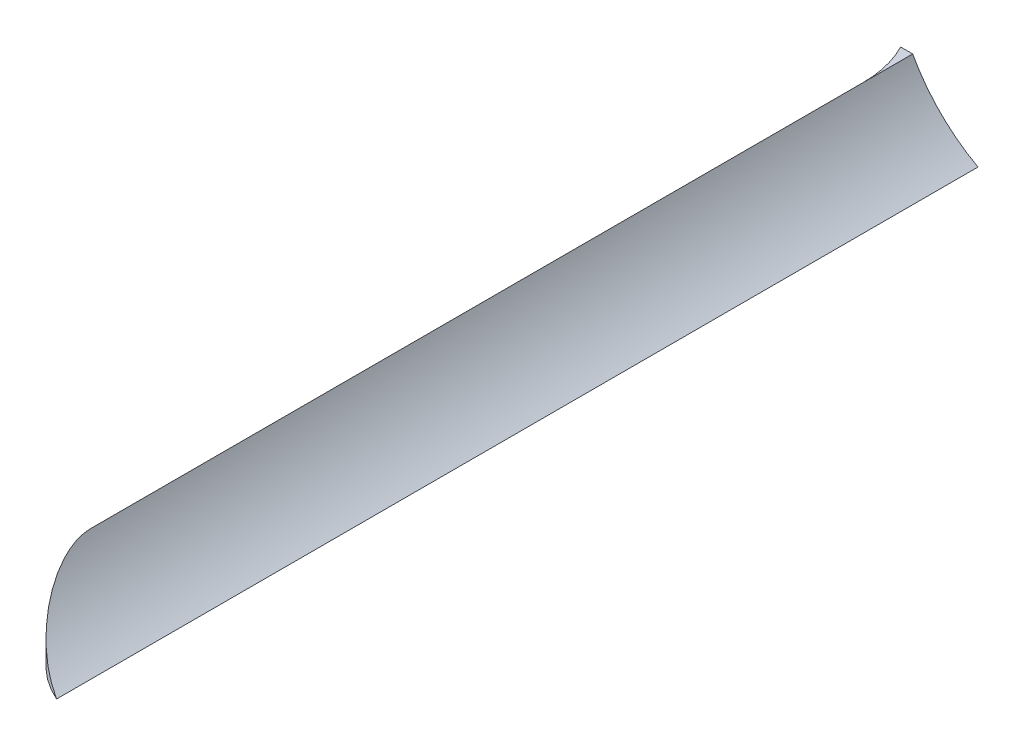
ISO-10303-21;
HEADER;
FILE_DESCRIPTION(('STEP AP214'),'2;1');
FILE_NAME('part.step','',(''),(''),'','','');
FILE_SCHEMA(('AUTOMOTIVE_DESIGN { 1 0 10303 214 1 1 1 1 }'));
ENDSEC;
DATA;
#1=APPLICATION_CONTEXT('core data for automotive mechanical design processes');
#2=APPLICATION_PROTOCOL_DEFINITION('international standard','automotive_design',2000,#1);
#3=PRODUCT_CONTEXT('',#1,'mechanical');
#4=PRODUCT('Part','Part','',(#3));
#5=PRODUCT_RELATED_PRODUCT_CATEGORY('part','',(#4));
#6=PRODUCT_DEFINITION_FORMATION('','',#4);
#7=PRODUCT_DEFINITION_CONTEXT('part definition',#1,'design');
#8=PRODUCT_DEFINITION('design','',#6,#7);
#9=PRODUCT_DEFINITION_SHAPE('','',#8);
#10=(LENGTH_UNIT() NAMED_UNIT(*) SI_UNIT(.MILLI.,.METRE.));
#11=(NAMED_UNIT(*) PLANE_ANGLE_UNIT() SI_UNIT($,.RADIAN.));
#12=(NAMED_UNIT(*) SI_UNIT($,.STERADIAN.) SOLID_ANGLE_UNIT());
#13=UNCERTAINTY_MEASURE_WITH_UNIT(LENGTH_MEASURE(1.E-05),#10,'distance_accuracy_value','');
#14=(GEOMETRIC_REPRESENTATION_CONTEXT(3) GLOBAL_UNCERTAINTY_ASSIGNED_CONTEXT((#13)) GLOBAL_UNIT_ASSIGNED_CONTEXT((#10,
#11,#12)) REPRESENTATION_CONTEXT('',''));
#15=CARTESIAN_POINT('',(0.,0.,0.));
#16=DIRECTION('',(0.,0.,1.));
#17=DIRECTION('',(1.,0.,0.));
#18=AXIS2_PLACEMENT_3D('',#15,#16,#17);
#19=CARTESIAN_POINT('',(-1.,0.,0.4572479123979));
#20=DIRECTION('',(0.,1.,0.));
#21=DIRECTION('',(0.,0.,1.));
#22=AXIS2_PLACEMENT_3D('',#19,#20,#21);
#23=CYLINDRICAL_SURFACE('',#22,1.);
#24=DIRECTION('',(0.,1.,0.));
#25=VECTOR('',#24,1.);
#26=CARTESIAN_POINT('',(-0.1106607246906,0.,0.));
#27=LINE('',#26,#25);
#28=CARTESIAN_POINT('',(-0.110660724690624,0.6,0.));
#29=VERTEX_POINT('',#28);
#30=CARTESIAN_POINT('',(-0.110660724690624,0.,0.));
#31=VERTEX_POINT('',#30);
#32=EDGE_CURVE('E59',#29,#31,#27,.F.);
#33=ORIENTED_EDGE('',*,*,#32,.T.);
#34=CARTESIAN_POINT('',(-1.,0.,0.4572479123979));
#35=DIRECTION('',(0.,1.,0.));
#36=DIRECTION('',(0.,0.,1.));
#37=AXIS2_PLACEMENT_3D('',#34,#35,#36);
#38=CIRCLE('',#37,1.);
#39=CARTESIAN_POINT('',(0.,0.,0.4572479123979));
#40=VERTEX_POINT('',#39);
#41=EDGE_CURVE('E122',#40,#31,#38,.T.);
#42=ORIENTED_EDGE('',*,*,#41,.F.);
#43=DIRECTION('',(0.,1.,0.));
#44=VECTOR('',#43,1.);
#45=CARTESIAN_POINT('',(0.,0.6,0.4572479123979));
#46=LINE('',#45,#44);
#47=CARTESIAN_POINT('',(1.2490009027033E-13,0.600000000000068,0.4572479123979));
#48=VERTEX_POINT('',#47);
#49=EDGE_CURVE('E60',#48,#40,#46,.F.);
#50=ORIENTED_EDGE('',*,*,#49,.F.);
#51=CARTESIAN_POINT('',(-1.,0.6,0.4572479123979));
#52=DIRECTION('',(0.,1.,0.));
#53=DIRECTION('',(0.,0.,1.));
#54=AXIS2_PLACEMENT_3D('',#51,#52,#53);
#55=CIRCLE('',#54,1.);
#56=EDGE_CURVE('E19',#29,#48,#55,.F.);
#57=ORIENTED_EDGE('',*,*,#56,.F.);
#58=EDGE_LOOP('',(#33,#42,#50,#57));
#59=FACE_BOUND('',#58,.T.);
#60=ADVANCED_FACE('F16',(#59),#23,.F.);
#61=CARTESIAN_POINT('',(1.,0.,7.55));
#62=DIRECTION('',(0.,1.,0.));
#63=DIRECTION('',(0.,0.,1.));
#64=AXIS2_PLACEMENT_3D('',#61,#62,#63);
#65=CYLINDRICAL_SURFACE('',#64,1.);
#66=CARTESIAN_POINT('',(1.,0.,7.55));
#67=DIRECTION('',(0.,1.,0.));
#68=DIRECTION('',(0.,0.,1.));
#69=AXIS2_PLACEMENT_3D('',#66,#67,#68);
#70=CIRCLE('',#69,1.);
#71=CARTESIAN_POINT('',(0.600000000000102,1.43396669214708E-13,8.46651513899121));
#72=VERTEX_POINT('',#71);
#73=CARTESIAN_POINT('',(0.,0.,7.55));
#74=VERTEX_POINT('',#73);
#75=EDGE_CURVE('E92',#72,#74,#70,.F.);
#76=ORIENTED_EDGE('',*,*,#75,.F.);
#77=CARTESIAN_POINT('',(0.600000000000069,2.86875633336372E-13,8.4665151389912));
#78=CARTESIAN_POINT('',(0.570312075614977,0.01616551991678,8.45355338562606));
#79=CARTESIAN_POINT('',(0.54163488125021,0.0330837160364432,8.43932597003594));
#80=CARTESIAN_POINT('',(0.486369742379199,0.068132853481344,8.40859421881288));
#81=CARTESIAN_POINT('',(0.459779245325686,0.0862622612762314,8.39209273527891));
#82=CARTESIAN_POINT('',(0.383170267730164,0.142065383923049,8.33953042426375));
#83=CARTESIAN_POINT('',(0.336270221781402,0.181178753494327,8.30039182956685));
#84=CARTESIAN_POINT('',(0.251126178114052,0.260679143637095,8.21542986113054));
#85=CARTESIAN_POINT('',(0.212840267591069,0.301058857730701,8.16964072131116));
#86=CARTESIAN_POINT('',(0.144548081988666,0.380730441526385,8.07133559402236));
#87=CARTESIAN_POINT('',(0.114535006554349,0.42002318068393,8.01882518381913));
#88=CARTESIAN_POINT('',(0.0753333682660203,0.475937518437359,7.93221033151673));
#89=CARTESIAN_POINT('',(0.0629451478904503,0.494616560476044,7.90087606867946));
#90=CARTESIAN_POINT('',(0.0410519662175126,0.5290119821326,7.83565599007688));
#91=CARTESIAN_POINT('',(0.0315425327065221,0.544732942618038,7.80177423515935));
#92=CARTESIAN_POINT('',(0.0175447482999643,0.56857804836934,7.73867500738627));
#93=CARTESIAN_POINT('',(0.0124241122906049,0.577601498370975,7.70994721688984));
#94=CARTESIAN_POINT('',(0.00469795617898697,0.591392547451365,7.65119484567434));
#95=CARTESIAN_POINT('',(0.00208378168612355,0.596174786396102,7.62117510384506));
#96=CARTESIAN_POINT('',(0.000277454481403536,0.599492917400397,7.57732171270156));
#97=CARTESIAN_POINT('',(-5.83925147511378E-06,0.600017342470199,7.5636610531472));
#98=CARTESIAN_POINT('',(0.,0.599999999998294,7.54999999999983));
#99=B_SPLINE_CURVE_WITH_KNOTS('',3,(#77,#78,#79,#80,#81,#82,#83,#84,#85,#86,#87,#88,#89,#90,#91,
#92,#93,#94,#95,#96,#97,#98),.UNSPECIFIED.,.F.,.F.,(4,2,2,2,2,2,2,2,2,2,4),(0.,
0.108501636077977,0.216868409065291,0.433441196948737,0.64893627684055,0.864253685700967,
0.979626427731263,1.09481900668519,1.18612507523134,1.27711473166702,1.31809052989402),.UNSPECIFIED.);
#100=CARTESIAN_POINT('',(1.2490009027033E-13,0.600000000000366,7.55));
#101=VERTEX_POINT('',#100);
#102=EDGE_CURVE('E84',#72,#101,#99,.T.);
#103=ORIENTED_EDGE('',*,*,#102,.T.);
#104=DIRECTION('',(0.,1.,0.));
#105=VECTOR('',#104,1.);
#106=CARTESIAN_POINT('',(0.,0.6,7.55));
#107=LINE('',#106,#105);
#108=EDGE_CURVE('E66',#74,#101,#107,.T.);
#109=ORIENTED_EDGE('',*,*,#108,.F.);
#110=EDGE_LOOP('',(#76,#103,#109));
#111=FACE_BOUND('',#110,.T.);
#112=ADVANCED_FACE('F96',(#111),#65,.T.);
#113=CARTESIAN_POINT('',(0.,0.6,0.));
#114=DIRECTION('',(-1.,0.,0.));
#115=DIRECTION('',(0.,0.,1.));
#116=AXIS2_PLACEMENT_3D('',#113,#114,#115);
#117=PLANE('',#116);
#118=DIRECTION('',(0.,0.,-1.));
#119=VECTOR('',#118,1.);
#120=CARTESIAN_POINT('',(0.,0.,0.));
#121=LINE('',#120,#119);
#122=EDGE_CURVE('E71',#74,#40,#121,.T.);
#123=ORIENTED_EDGE('',*,*,#122,.F.);
#124=ORIENTED_EDGE('',*,*,#108,.T.);
#125=DIRECTION('',(0.,0.,1.));
#126=VECTOR('',#125,1.);
#127=CARTESIAN_POINT('',(2.4980018054066E-13,0.600000000000137,0.));
#128=LINE('',#127,#126);
#129=EDGE_CURVE('E80',#101,#48,#128,.F.);
#130=ORIENTED_EDGE('',*,*,#129,.T.);
#131=ORIENTED_EDGE('',*,*,#49,.T.);
#132=EDGE_LOOP('',(#123,#124,#130,#131));
#133=FACE_BOUND('',#132,.T.);
#134=ADVANCED_FACE('F100',(#133),#117,.T.);
#135=CARTESIAN_POINT('',(0.,0.6,0.));
#136=DIRECTION('',(0.,1.,0.));
#137=DIRECTION('',(0.,0.,1.));
#138=AXIS2_PLACEMENT_3D('',#135,#136,#137);
#139=PLANE('',#138);
#140=ORIENTED_EDGE('',*,*,#56,.T.);
#141=DIRECTION('',(0.,0.,1.));
#142=VECTOR('',#141,1.);
#143=CARTESIAN_POINT('',(2.4980018054066E-13,0.600000000000137,0.));
#144=LINE('',#143,#142);
#145=CARTESIAN_POINT('',(2.87096735274162E-13,0.600000000000068,0.));
#146=VERTEX_POINT('',#145);
#147=EDGE_CURVE('E74',#48,#146,#144,.F.);
#148=ORIENTED_EDGE('',*,*,#147,.T.);
#149=DIRECTION('',(1.,0.,0.));
#150=VECTOR('',#149,1.);
#151=CARTESIAN_POINT('',(0.,0.6,0.));
#152=LINE('',#151,#150);
#153=EDGE_CURVE('E65',#146,#29,#152,.F.);
#154=ORIENTED_EDGE('',*,*,#153,.T.);
#155=EDGE_LOOP('',(#140,#148,#154));
#156=FACE_BOUND('',#155,.T.);
#157=ADVANCED_FACE('F73',(#156),#139,.T.);
#158=CARTESIAN_POINT('',(0.,0.,0.));
#159=DIRECTION('',(0.,0.,1.));
#160=DIRECTION('',(1.,0.,0.));
#161=AXIS2_PLACEMENT_3D('',#158,#159,#160);
#162=PLANE('',#161);
#163=ORIENTED_EDGE('',*,*,#32,.F.);
#164=ORIENTED_EDGE('',*,*,#153,.F.);
#165=CARTESIAN_POINT('',(1.317349497469,1.317349497469,0.));
#166=DIRECTION('',(0.,0.,1.));
#167=DIRECTION('',(1.,0.,0.));
#168=AXIS2_PLACEMENT_3D('',#165,#166,#167);
#169=CIRCLE('',#168,1.5);
#170=CARTESIAN_POINT('',(0.600000000000366,1.25225350922076E-13,0.));
#171=VERTEX_POINT('',#170);
#172=EDGE_CURVE('E25',#146,#171,#169,.T.);
#173=ORIENTED_EDGE('',*,*,#172,.T.);
#174=DIRECTION('',(1.,0.,0.));
#175=VECTOR('',#174,1.);
#176=CARTESIAN_POINT('',(0.,0.,0.));
#177=LINE('',#176,#175);
#178=EDGE_CURVE('E33',#31,#171,#177,.T.);
#179=ORIENTED_EDGE('',*,*,#178,.F.);
#180=EDGE_LOOP('',(#163,#164,#173,#179));
#181=FACE_BOUND('',#180,.T.);
#182=ADVANCED_FACE('F68',(#181),#162,.F.);
#183=CARTESIAN_POINT('',(0.,0.,0.));
#184=DIRECTION('',(0.,-1.,0.));
#185=DIRECTION('',(0.,0.,-1.));
#186=AXIS2_PLACEMENT_3D('',#183,#184,#185);
#187=PLANE('',#186);
#188=DIRECTION('',(0.,0.,1.));
#189=VECTOR('',#188,1.);
#190=CARTESIAN_POINT('',(0.600000000000136,2.50450701844151E-13,0.));
#191=LINE('',#190,#189);
#192=EDGE_CURVE('E11',#171,#72,#191,.T.);
#193=ORIENTED_EDGE('',*,*,#192,.T.);
#194=ORIENTED_EDGE('',*,*,#75,.T.);
#195=ORIENTED_EDGE('',*,*,#122,.T.);
#196=ORIENTED_EDGE('',*,*,#41,.T.);
#197=ORIENTED_EDGE('',*,*,#178,.T.);
#198=EDGE_LOOP('',(#193,#194,#195,#196,#197));
#199=FACE_BOUND('',#198,.T.);
#200=ADVANCED_FACE('F108',(#199),#187,.T.);
#201=CARTESIAN_POINT('',(1.317349497469,1.317349497469,0.));
#202=DIRECTION('',(0.,0.,1.));
#203=DIRECTION('',(1.,0.,0.));
#204=AXIS2_PLACEMENT_3D('',#201,#202,#203);
#205=CYLINDRICAL_SURFACE('',#204,1.5);
#206=ORIENTED_EDGE('',*,*,#172,.F.);
#207=ORIENTED_EDGE('',*,*,#147,.F.);
#208=ORIENTED_EDGE('',*,*,#129,.F.);
#209=ORIENTED_EDGE('',*,*,#102,.F.);
#210=ORIENTED_EDGE('',*,*,#192,.F.);
#211=EDGE_LOOP('',(#206,#207,#208,#209,#210));
#212=FACE_BOUND('',#211,.T.);
#213=ADVANCED_FACE('F93',(#212),#205,.F.);
#214=CLOSED_SHELL('',(#60,#112,#134,#157,#182,#200,#213));
#215=MANIFOLD_SOLID_BREP('B1',#214);
#216=ADVANCED_BREP_SHAPE_REPRESENTATION('',(#18,#215),#14);
#217=SHAPE_DEFINITION_REPRESENTATION(#9,#216);
ENDSEC;
END-ISO-10303-21;
